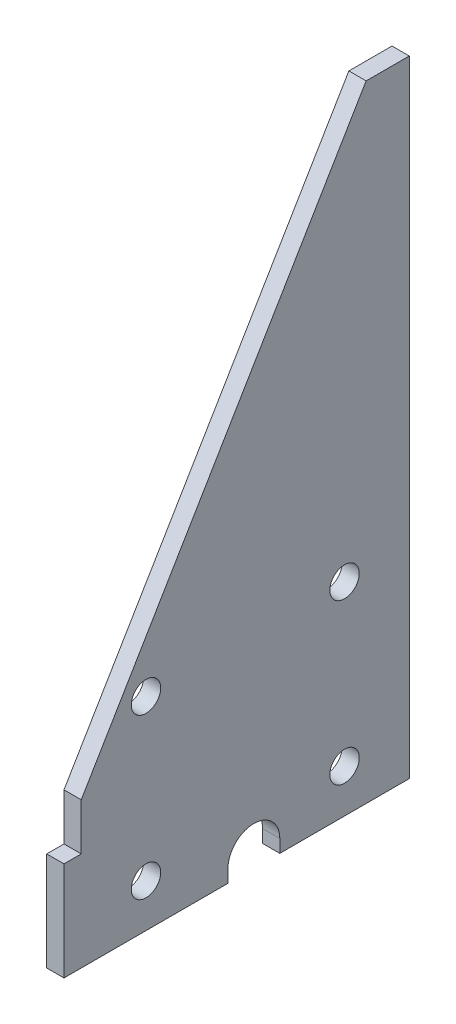
ISO-10303-21;
HEADER;
FILE_DESCRIPTION(('STEP AP214'),'2;1');
FILE_NAME('part.step','',(''),(''),'','','');
FILE_SCHEMA(('AUTOMOTIVE_DESIGN { 1 0 10303 214 1 1 1 1 }'));
ENDSEC;
DATA;
#1=APPLICATION_CONTEXT('core data for automotive mechanical design processes');
#2=APPLICATION_PROTOCOL_DEFINITION('international standard','automotive_design',2000,#1);
#3=PRODUCT_CONTEXT('',#1,'mechanical');
#4=PRODUCT('Part','Part','',(#3));
#5=PRODUCT_RELATED_PRODUCT_CATEGORY('part','',(#4));
#6=PRODUCT_DEFINITION_FORMATION('','',#4);
#7=PRODUCT_DEFINITION_CONTEXT('part definition',#1,'design');
#8=PRODUCT_DEFINITION('design','',#6,#7);
#9=PRODUCT_DEFINITION_SHAPE('','',#8);
#10=(LENGTH_UNIT() NAMED_UNIT(*) SI_UNIT(.MILLI.,.METRE.));
#11=(NAMED_UNIT(*) PLANE_ANGLE_UNIT() SI_UNIT($,.RADIAN.));
#12=(NAMED_UNIT(*) SI_UNIT($,.STERADIAN.) SOLID_ANGLE_UNIT());
#13=UNCERTAINTY_MEASURE_WITH_UNIT(LENGTH_MEASURE(1.E-05),#10,'distance_accuracy_value','');
#14=(GEOMETRIC_REPRESENTATION_CONTEXT(3) GLOBAL_UNCERTAINTY_ASSIGNED_CONTEXT((#13)) GLOBAL_UNIT_ASSIGNED_CONTEXT((#10,
#11,#12)) REPRESENTATION_CONTEXT('',''));
#15=CARTESIAN_POINT('',(0.,0.,0.));
#16=DIRECTION('',(0.,0.,1.));
#17=DIRECTION('',(1.,0.,0.));
#18=AXIS2_PLACEMENT_3D('',#15,#16,#17);
#19=CARTESIAN_POINT('',(4.,-57.5000000000004,37.9999999999989));
#20=DIRECTION('',(0.,1.,0.));
#21=DIRECTION('',(0.,0.,1.));
#22=AXIS2_PLACEMENT_3D('',#19,#20,#21);
#23=PLANE('',#22);
#24=DIRECTION('',(0.,0.,-1.));
#25=VECTOR('',#24,1.);
#26=CARTESIAN_POINT('',(4.,-57.5000000000004,37.9999999999989));
#27=LINE('',#26,#25);
#28=CARTESIAN_POINT('',(4.,-57.5000000000004,-12.0000000000012));
#29=VERTEX_POINT('',#28);
#30=CARTESIAN_POINT('',(4.,-57.5000000000004,-42.0000000000011));
#31=VERTEX_POINT('',#30);
#32=EDGE_CURVE('E205',#29,#31,#27,.T.);
#33=ORIENTED_EDGE('',*,*,#32,.F.);
#34=DIRECTION('',(1.,0.,0.));
#35=VECTOR('',#34,1.);
#36=CARTESIAN_POINT('',(-0.00100000000000013,-57.5000000000004,-12.0000000000012));
#37=LINE('',#36,#35);
#38=CARTESIAN_POINT('',(0.,-57.5000000000004,-12.0000000000012));
#39=VERTEX_POINT('',#38);
#40=EDGE_CURVE('E225',#39,#29,#37,.T.);
#41=ORIENTED_EDGE('',*,*,#40,.F.);
#42=DIRECTION('',(0.,0.,-1.));
#43=VECTOR('',#42,1.);
#44=CARTESIAN_POINT('',(0.,-57.5000000000004,37.9999999999989));
#45=LINE('',#44,#43);
#46=CARTESIAN_POINT('',(0.,-57.5000000000004,-42.0000000000011));
#47=VERTEX_POINT('',#46);
#48=EDGE_CURVE('E165',#39,#47,#45,.T.);
#49=ORIENTED_EDGE('',*,*,#48,.T.);
#50=DIRECTION('',(-1.,0.,0.));
#51=VECTOR('',#50,1.);
#52=CARTESIAN_POINT('',(4.,-57.5000000000004,-42.0000000000011));
#53=LINE('',#52,#51);
#54=EDGE_CURVE('E189',#31,#47,#53,.T.);
#55=ORIENTED_EDGE('',*,*,#54,.F.);
#56=EDGE_LOOP('',(#33,#41,#49,#55));
#57=FACE_BOUND('',#56,.T.);
#58=ADVANCED_FACE('F45',(#57),#23,.F.);
#59=CARTESIAN_POINT('',(4.,87.4999999999995,-32.0000000000012));
#60=DIRECTION('',(0.,1.,0.));
#61=DIRECTION('',(0.,0.,1.));
#62=AXIS2_PLACEMENT_3D('',#59,#60,#61);
#63=PLANE('',#62);
#64=DIRECTION('',(0.,0.,-1.));
#65=VECTOR('',#64,1.);
#66=CARTESIAN_POINT('',(0.,87.4999999999995,-32.0000000000012));
#67=LINE('',#66,#65);
#68=CARTESIAN_POINT('',(0.,87.4999999999995,-32.0000000000012));
#69=VERTEX_POINT('',#68);
#70=CARTESIAN_POINT('',(0.,87.4999999999995,-42.0000000000012));
#71=VERTEX_POINT('',#70);
#72=EDGE_CURVE('E156',#69,#71,#67,.T.);
#73=ORIENTED_EDGE('',*,*,#72,.F.);
#74=DIRECTION('',(-1.,0.,0.));
#75=VECTOR('',#74,1.);
#76=CARTESIAN_POINT('',(4.,87.4999999999995,-32.0000000000012));
#77=LINE('',#76,#75);
#78=CARTESIAN_POINT('',(4.,87.4999999999995,-32.0000000000012));
#79=VERTEX_POINT('',#78);
#80=EDGE_CURVE('E11',#79,#69,#77,.T.);
#81=ORIENTED_EDGE('',*,*,#80,.F.);
#82=DIRECTION('',(0.,0.,-1.));
#83=VECTOR('',#82,1.);
#84=CARTESIAN_POINT('',(4.,87.4999999999995,-32.0000000000012));
#85=LINE('',#84,#83);
#86=CARTESIAN_POINT('',(4.,87.4999999999995,-42.0000000000012));
#87=VERTEX_POINT('',#86);
#88=EDGE_CURVE('E180',#79,#87,#85,.T.);
#89=ORIENTED_EDGE('',*,*,#88,.T.);
#90=DIRECTION('',(-1.,0.,0.));
#91=VECTOR('',#90,1.);
#92=CARTESIAN_POINT('',(4.,87.4999999999995,-42.0000000000012));
#93=LINE('',#92,#91);
#94=EDGE_CURVE('E49',#87,#71,#93,.T.);
#95=ORIENTED_EDGE('',*,*,#94,.T.);
#96=EDGE_LOOP('',(#73,#81,#89,#95));
#97=FACE_BOUND('',#96,.T.);
#98=ADVANCED_FACE('F47',(#97),#63,.T.);
#99=CARTESIAN_POINT('',(4.,87.4999999999995,-32.0000000000012));
#100=DIRECTION('',(0.,-0.510258904912213,-0.860020842746145));
#101=DIRECTION('',(0.,0.860020842746145,-0.510258904912213));
#102=AXIS2_PLACEMENT_3D('',#99,#100,#101);
#103=PLANE('',#102);
#104=DIRECTION('',(0.,-0.860020842746145,0.510258904912213));
#105=VECTOR('',#104,1.);
#106=CARTESIAN_POINT('',(0.,87.4999999999995,-32.0000000000012));
#107=LINE('',#106,#105);
#108=CARTESIAN_POINT('',(0.,-23.7403430392094,33.9999999999989));
#109=VERTEX_POINT('',#108);
#110=EDGE_CURVE('E178',#69,#109,#107,.T.);
#111=ORIENTED_EDGE('',*,*,#110,.T.);
#112=DIRECTION('',(-1.,0.,0.));
#113=VECTOR('',#112,1.);
#114=CARTESIAN_POINT('',(4.,-23.7403430392094,33.9999999999989));
#115=LINE('',#114,#113);
#116=CARTESIAN_POINT('',(4.,-23.7403430392094,33.9999999999989));
#117=VERTEX_POINT('',#116);
#118=EDGE_CURVE('E55',#117,#109,#115,.T.);
#119=ORIENTED_EDGE('',*,*,#118,.F.);
#120=DIRECTION('',(0.,-0.860020842746145,0.510258904912213));
#121=VECTOR('',#120,1.);
#122=CARTESIAN_POINT('',(4.,87.4999999999995,-32.0000000000012));
#123=LINE('',#122,#121);
#124=EDGE_CURVE('E127',#79,#117,#123,.T.);
#125=ORIENTED_EDGE('',*,*,#124,.F.);
#126=ORIENTED_EDGE('',*,*,#80,.T.);
#127=EDGE_LOOP('',(#111,#119,#125,#126));
#128=FACE_BOUND('',#127,.T.);
#129=ADVANCED_FACE('F200',(#128),#103,.F.);
#130=CARTESIAN_POINT('',(4.,-23.7403430392094,33.9999999999989));
#131=DIRECTION('',(0.,0.,-1.));
#132=DIRECTION('',(-1.,0.,0.));
#133=AXIS2_PLACEMENT_3D('',#130,#131,#132);
#134=PLANE('',#133);
#135=DIRECTION('',(0.,-1.,0.));
#136=VECTOR('',#135,1.);
#137=CARTESIAN_POINT('',(0.,-23.7403430392094,33.9999999999989));
#138=LINE('',#137,#136);
#139=CARTESIAN_POINT('',(0.,-34.6028137707301,33.9999999999989));
#140=VERTEX_POINT('',#139);
#141=EDGE_CURVE('E137',#109,#140,#138,.T.);
#142=ORIENTED_EDGE('',*,*,#141,.T.);
#143=DIRECTION('',(-1.,0.,0.));
#144=VECTOR('',#143,1.);
#145=CARTESIAN_POINT('',(4.,-34.6028137707301,33.9999999999989));
#146=LINE('',#145,#144);
#147=CARTESIAN_POINT('',(4.,-34.6028137707301,33.9999999999989));
#148=VERTEX_POINT('',#147);
#149=EDGE_CURVE('E134',#148,#140,#146,.T.);
#150=ORIENTED_EDGE('',*,*,#149,.F.);
#151=DIRECTION('',(0.,-1.,0.));
#152=VECTOR('',#151,1.);
#153=CARTESIAN_POINT('',(4.,-23.7403430392094,33.9999999999989));
#154=LINE('',#153,#152);
#155=EDGE_CURVE('E119',#117,#148,#154,.T.);
#156=ORIENTED_EDGE('',*,*,#155,.F.);
#157=ORIENTED_EDGE('',*,*,#118,.T.);
#158=EDGE_LOOP('',(#142,#150,#156,#157));
#159=FACE_BOUND('',#158,.T.);
#160=ADVANCED_FACE('F135',(#159),#134,.F.);
#161=CARTESIAN_POINT('',(4.,-34.6028137707301,33.9999999999989));
#162=DIRECTION('',(0.,-1.,0.));
#163=DIRECTION('',(0.,0.,-1.));
#164=AXIS2_PLACEMENT_3D('',#161,#162,#163);
#165=PLANE('',#164);
#166=DIRECTION('',(0.,0.,1.));
#167=VECTOR('',#166,1.);
#168=CARTESIAN_POINT('',(0.,-34.6028137707301,33.9999999999989));
#169=LINE('',#168,#167);
#170=CARTESIAN_POINT('',(0.,-34.6028137707301,37.9999999999989));
#171=VERTEX_POINT('',#170);
#172=EDGE_CURVE('E173',#140,#171,#169,.T.);
#173=ORIENTED_EDGE('',*,*,#172,.T.);
#174=DIRECTION('',(-1.,0.,0.));
#175=VECTOR('',#174,1.);
#176=CARTESIAN_POINT('',(4.,-34.6028137707301,37.9999999999989));
#177=LINE('',#176,#175);
#178=CARTESIAN_POINT('',(4.,-34.6028137707301,37.9999999999989));
#179=VERTEX_POINT('',#178);
#180=EDGE_CURVE('E141',#179,#171,#177,.T.);
#181=ORIENTED_EDGE('',*,*,#180,.F.);
#182=DIRECTION('',(0.,0.,1.));
#183=VECTOR('',#182,1.);
#184=CARTESIAN_POINT('',(4.,-34.6028137707301,33.9999999999989));
#185=LINE('',#184,#183);
#186=EDGE_CURVE('E124',#148,#179,#185,.T.);
#187=ORIENTED_EDGE('',*,*,#186,.F.);
#188=ORIENTED_EDGE('',*,*,#149,.T.);
#189=EDGE_LOOP('',(#173,#181,#187,#188));
#190=FACE_BOUND('',#189,.T.);
#191=ADVANCED_FACE('F143',(#190),#165,.F.);
#192=CARTESIAN_POINT('',(4.,-34.6028137707301,37.9999999999989));
#193=DIRECTION('',(0.,0.,-1.));
#194=DIRECTION('',(-1.,0.,0.));
#195=AXIS2_PLACEMENT_3D('',#192,#193,#194);
#196=PLANE('',#195);
#197=DIRECTION('',(0.,-1.,0.));
#198=VECTOR('',#197,1.);
#199=CARTESIAN_POINT('',(0.,-34.6028137707301,37.9999999999989));
#200=LINE('',#199,#198);
#201=CARTESIAN_POINT('',(0.,-57.5000000000004,37.9999999999989));
#202=VERTEX_POINT('',#201);
#203=EDGE_CURVE('E170',#171,#202,#200,.T.);
#204=ORIENTED_EDGE('',*,*,#203,.T.);
#205=DIRECTION('',(-1.,0.,0.));
#206=VECTOR('',#205,1.);
#207=CARTESIAN_POINT('',(4.,-57.5000000000004,37.9999999999989));
#208=LINE('',#207,#206);
#209=CARTESIAN_POINT('',(4.,-57.5000000000004,37.9999999999989));
#210=VERTEX_POINT('',#209);
#211=EDGE_CURVE('E186',#210,#202,#208,.T.);
#212=ORIENTED_EDGE('',*,*,#211,.F.);
#213=DIRECTION('',(0.,-1.,0.));
#214=VECTOR('',#213,1.);
#215=CARTESIAN_POINT('',(4.,-34.6028137707301,37.9999999999989));
#216=LINE('',#215,#214);
#217=EDGE_CURVE('E147',#179,#210,#216,.T.);
#218=ORIENTED_EDGE('',*,*,#217,.F.);
#219=ORIENTED_EDGE('',*,*,#180,.T.);
#220=EDGE_LOOP('',(#204,#212,#218,#219));
#221=FACE_BOUND('',#220,.T.);
#222=ADVANCED_FACE('F309',(#221),#196,.F.);
#223=CARTESIAN_POINT('',(0.,-57.5000000000004,0.));
#224=VERTEX_POINT('',#223);
#225=EDGE_CURVE('E166',#202,#224,#45,.T.);
#226=ORIENTED_EDGE('',*,*,#225,.T.);
#227=DIRECTION('',(1.,0.,0.));
#228=VECTOR('',#227,1.);
#229=CARTESIAN_POINT('',(-0.00100000000000013,-57.5000000000004,-1.13450915328883E-12));
#230=LINE('',#229,#228);
#231=CARTESIAN_POINT('',(4.,-57.5000000000004,-1.13450915328883E-12));
#232=VERTEX_POINT('',#231);
#233=EDGE_CURVE('E63',#224,#232,#230,.T.);
#234=ORIENTED_EDGE('',*,*,#233,.T.);
#235=EDGE_CURVE('E150',#210,#232,#27,.T.);
#236=ORIENTED_EDGE('',*,*,#235,.F.);
#237=ORIENTED_EDGE('',*,*,#211,.T.);
#238=EDGE_LOOP('',(#226,#234,#236,#237));
#239=FACE_BOUND('',#238,.T.);
#240=ADVANCED_FACE('F305',(#239),#23,.F.);
#241=CARTESIAN_POINT('',(4.,87.4999999999995,-42.0000000000012));
#242=DIRECTION('',(0.,0.,-1.));
#243=DIRECTION('',(0.,1.,0.));
#244=AXIS2_PLACEMENT_3D('',#241,#242,#243);
#245=PLANE('',#244);
#246=DIRECTION('',(0.,-1.,0.));
#247=VECTOR('',#246,1.);
#248=CARTESIAN_POINT('',(0.,87.4999999999995,-42.0000000000012));
#249=LINE('',#248,#247);
#250=EDGE_CURVE('E160',#71,#47,#249,.T.);
#251=ORIENTED_EDGE('',*,*,#250,.F.);
#252=ORIENTED_EDGE('',*,*,#94,.F.);
#253=DIRECTION('',(0.,-1.,0.));
#254=VECTOR('',#253,1.);
#255=CARTESIAN_POINT('',(4.,87.4999999999995,-42.0000000000012));
#256=LINE('',#255,#254);
#257=EDGE_CURVE('E201',#87,#31,#256,.T.);
#258=ORIENTED_EDGE('',*,*,#257,.T.);
#259=ORIENTED_EDGE('',*,*,#54,.T.);
#260=EDGE_LOOP('',(#251,#252,#258,#259));
#261=FACE_BOUND('',#260,.T.);
#262=ADVANCED_FACE('F194',(#261),#245,.T.);
#263=CARTESIAN_POINT('',(4.,0.,0.));
#264=DIRECTION('',(-1.,0.,0.));
#265=DIRECTION('',(0.,0.,1.));
#266=AXIS2_PLACEMENT_3D('',#263,#264,#265);
#267=PLANE('',#266);
#268=CARTESIAN_POINT('',(4.,-47.5000000000004,-27.0000000000012));
#269=DIRECTION('',(-1.,0.,0.));
#270=DIRECTION('',(0.,0.,1.));
#271=AXIS2_PLACEMENT_3D('',#268,#269,#270);
#272=CIRCLE('',#271,3.41);
#273=CARTESIAN_POINT('',(4.,-47.5000000000004,-23.5900000000012));
#274=VERTEX_POINT('',#273);
#275=EDGE_CURVE('E240',#274,#274,#272,.F.);
#276=ORIENTED_EDGE('',*,*,#275,.F.);
#277=EDGE_LOOP('',(#276));
#278=FACE_BOUND('',#277,.T.);
#279=CARTESIAN_POINT('',(4.,-47.5000000000004,18.9999999999989));
#280=DIRECTION('',(-1.,0.,0.));
#281=DIRECTION('',(0.,0.,1.));
#282=AXIS2_PLACEMENT_3D('',#279,#280,#281);
#283=CIRCLE('',#282,3.41);
#284=CARTESIAN_POINT('',(4.,-47.5000000000004,22.4099999999989));
#285=VERTEX_POINT('',#284);
#286=EDGE_CURVE('E247',#285,#285,#283,.F.);
#287=ORIENTED_EDGE('',*,*,#286,.F.);
#288=EDGE_LOOP('',(#287));
#289=FACE_BOUND('',#288,.T.);
#290=CARTESIAN_POINT('',(4.,-10.5000000000004,-27.0000000000011));
#291=DIRECTION('',(-1.,0.,0.));
#292=DIRECTION('',(0.,0.,1.));
#293=AXIS2_PLACEMENT_3D('',#290,#291,#292);
#294=CIRCLE('',#293,3.41);
#295=CARTESIAN_POINT('',(4.,-10.5000000000004,-23.5900000000011));
#296=VERTEX_POINT('',#295);
#297=EDGE_CURVE('E161',#296,#296,#294,.F.);
#298=ORIENTED_EDGE('',*,*,#297,.F.);
#299=EDGE_LOOP('',(#298));
#300=FACE_BOUND('',#299,.T.);
#301=CARTESIAN_POINT('',(4.,-10.5000000000004,18.9999999999989));
#302=DIRECTION('',(-1.,0.,0.));
#303=DIRECTION('',(0.,0.,1.));
#304=AXIS2_PLACEMENT_3D('',#301,#302,#303);
#305=CIRCLE('',#304,3.41);
#306=CARTESIAN_POINT('',(4.,-10.5000000000004,22.4099999999989));
#307=VERTEX_POINT('',#306);
#308=EDGE_CURVE('E208',#307,#307,#305,.F.);
#309=ORIENTED_EDGE('',*,*,#308,.F.);
#310=EDGE_LOOP('',(#309));
#311=FACE_BOUND('',#310,.T.);
#312=CARTESIAN_POINT('',(4.,-54.5000000000004,-6.00000000000113));
#313=DIRECTION('',(1.,0.,0.));
#314=DIRECTION('',(0.,0.,-1.));
#315=AXIS2_PLACEMENT_3D('',#312,#313,#314);
#316=CIRCLE('',#315,6.00000000000001);
#317=CARTESIAN_POINT('',(4.,-54.5000000000004,-12.0000000000012));
#318=VERTEX_POINT('',#317);
#319=CARTESIAN_POINT('',(4.,-54.5000000000004,-1.13450915328883E-12));
#320=VERTEX_POINT('',#319);
#321=EDGE_CURVE('E275',#318,#320,#316,.T.);
#322=ORIENTED_EDGE('',*,*,#321,.F.);
#323=DIRECTION('',(0.,1.,0.));
#324=VECTOR('',#323,1.);
#325=CARTESIAN_POINT('',(4.,-57.5000000000004,-12.0000000000012));
#326=LINE('',#325,#324);
#327=EDGE_CURVE('E220',#29,#318,#326,.T.);
#328=ORIENTED_EDGE('',*,*,#327,.F.);
#329=ORIENTED_EDGE('',*,*,#32,.T.);
#330=ORIENTED_EDGE('',*,*,#257,.F.);
#331=ORIENTED_EDGE('',*,*,#88,.F.);
#332=ORIENTED_EDGE('',*,*,#124,.T.);
#333=ORIENTED_EDGE('',*,*,#155,.T.);
#334=ORIENTED_EDGE('',*,*,#186,.T.);
#335=ORIENTED_EDGE('',*,*,#217,.T.);
#336=ORIENTED_EDGE('',*,*,#235,.T.);
#337=DIRECTION('',(0.,-1.,0.));
#338=VECTOR('',#337,1.);
#339=CARTESIAN_POINT('',(4.,-54.5000000000004,-1.13450915328883E-12));
#340=LINE('',#339,#338);
#341=EDGE_CURVE('E272',#320,#232,#340,.T.);
#342=ORIENTED_EDGE('',*,*,#341,.F.);
#343=EDGE_LOOP('',(#322,#328,#329,#330,#331,#332,#333,#334,#335,#336,#342));
#344=FACE_BOUND('',#343,.T.);
#345=ADVANCED_FACE('F122',(#278,#289,#300,#311,#344),#267,.F.);
#346=CARTESIAN_POINT('',(0.,0.,0.));
#347=DIRECTION('',(-1.,0.,0.));
#348=DIRECTION('',(0.,0.,1.));
#349=AXIS2_PLACEMENT_3D('',#346,#347,#348);
#350=PLANE('',#349);
#351=DIRECTION('',(0.,1.,0.));
#352=VECTOR('',#351,1.);
#353=CARTESIAN_POINT('',(0.,-57.5000000000004,-12.0000000000012));
#354=LINE('',#353,#352);
#355=CARTESIAN_POINT('',(0.,-54.5000000000004,-12.0000000000011));
#356=VERTEX_POINT('',#355);
#357=EDGE_CURVE('E279',#39,#356,#354,.T.);
#358=ORIENTED_EDGE('',*,*,#357,.T.);
#359=CARTESIAN_POINT('',(0.,-54.5000000000004,-6.00000000000113));
#360=DIRECTION('',(-1.,0.,0.));
#361=DIRECTION('',(0.,0.,1.));
#362=AXIS2_PLACEMENT_3D('',#359,#360,#361);
#363=CIRCLE('',#362,6.00000000000001);
#364=CARTESIAN_POINT('',(0.,-54.5000000000004,-1.13450915328883E-12));
#365=VERTEX_POINT('',#364);
#366=EDGE_CURVE('E282',#356,#365,#363,.F.);
#367=ORIENTED_EDGE('',*,*,#366,.T.);
#368=DIRECTION('',(0.,-1.,0.));
#369=VECTOR('',#368,1.);
#370=CARTESIAN_POINT('',(0.,-54.5000000000004,-1.13450915328883E-12));
#371=LINE('',#370,#369);
#372=EDGE_CURVE('E255',#365,#224,#371,.T.);
#373=ORIENTED_EDGE('',*,*,#372,.T.);
#374=ORIENTED_EDGE('',*,*,#225,.F.);
#375=ORIENTED_EDGE('',*,*,#203,.F.);
#376=ORIENTED_EDGE('',*,*,#172,.F.);
#377=ORIENTED_EDGE('',*,*,#141,.F.);
#378=ORIENTED_EDGE('',*,*,#110,.F.);
#379=ORIENTED_EDGE('',*,*,#72,.T.);
#380=ORIENTED_EDGE('',*,*,#250,.T.);
#381=ORIENTED_EDGE('',*,*,#48,.F.);
#382=EDGE_LOOP('',(#358,#367,#373,#374,#375,#376,#377,#378,#379,#380,#381));
#383=FACE_BOUND('',#382,.T.);
#384=CARTESIAN_POINT('',(0.,-47.5000000000004,-27.0000000000012));
#385=DIRECTION('',(-1.,0.,0.));
#386=DIRECTION('',(0.,0.,1.));
#387=AXIS2_PLACEMENT_3D('',#384,#385,#386);
#388=CIRCLE('',#387,3.41);
#389=CARTESIAN_POINT('',(0.,-47.5000000000004,-23.5900000000012));
#390=VERTEX_POINT('',#389);
#391=EDGE_CURVE('E243',#390,#390,#388,.T.);
#392=ORIENTED_EDGE('',*,*,#391,.F.);
#393=EDGE_LOOP('',(#392));
#394=FACE_BOUND('',#393,.T.);
#395=CARTESIAN_POINT('',(0.,-47.5000000000004,18.9999999999989));
#396=DIRECTION('',(-1.,0.,0.));
#397=DIRECTION('',(0.,0.,1.));
#398=AXIS2_PLACEMENT_3D('',#395,#396,#397);
#399=CIRCLE('',#398,3.41);
#400=CARTESIAN_POINT('',(0.,-47.5000000000004,22.4099999999989));
#401=VERTEX_POINT('',#400);
#402=EDGE_CURVE('E251',#401,#401,#399,.T.);
#403=ORIENTED_EDGE('',*,*,#402,.F.);
#404=EDGE_LOOP('',(#403));
#405=FACE_BOUND('',#404,.T.);
#406=CARTESIAN_POINT('',(0.,-10.5000000000004,-27.0000000000011));
#407=DIRECTION('',(-1.,0.,0.));
#408=DIRECTION('',(0.,0.,1.));
#409=AXIS2_PLACEMENT_3D('',#406,#407,#408);
#410=CIRCLE('',#409,3.41);
#411=CARTESIAN_POINT('',(0.,-10.5000000000004,-23.5900000000011));
#412=VERTEX_POINT('',#411);
#413=EDGE_CURVE('E230',#412,#412,#410,.T.);
#414=ORIENTED_EDGE('',*,*,#413,.F.);
#415=EDGE_LOOP('',(#414));
#416=FACE_BOUND('',#415,.T.);
#417=CARTESIAN_POINT('',(0.,-10.5000000000004,18.9999999999989));
#418=DIRECTION('',(-1.,0.,0.));
#419=DIRECTION('',(0.,0.,1.));
#420=AXIS2_PLACEMENT_3D('',#417,#418,#419);
#421=CIRCLE('',#420,3.41);
#422=CARTESIAN_POINT('',(0.,-10.5000000000004,22.4099999999989));
#423=VERTEX_POINT('',#422);
#424=EDGE_CURVE('E237',#423,#423,#421,.T.);
#425=ORIENTED_EDGE('',*,*,#424,.F.);
#426=EDGE_LOOP('',(#425));
#427=FACE_BOUND('',#426,.T.);
#428=ADVANCED_FACE('F198',(#383,#394,#405,#416,#427),#350,.T.);
#429=CARTESIAN_POINT('',(4.001,-10.5000000000004,18.9999999999989));
#430=DIRECTION('',(-1.,0.,0.));
#431=DIRECTION('',(0.,0.,1.));
#432=AXIS2_PLACEMENT_3D('',#429,#430,#431);
#433=CYLINDRICAL_SURFACE('',#432,3.41);
#434=ORIENTED_EDGE('',*,*,#424,.T.);
#435=EDGE_LOOP('',(#434));
#436=FACE_BOUND('',#435,.T.);
#437=ORIENTED_EDGE('',*,*,#308,.T.);
#438=EDGE_LOOP('',(#437));
#439=FACE_BOUND('',#438,.T.);
#440=ADVANCED_FACE('F333',(#436,#439),#433,.F.);
#441=CARTESIAN_POINT('',(4.001,-10.5000000000004,-27.0000000000011));
#442=DIRECTION('',(-1.,0.,0.));
#443=DIRECTION('',(0.,0.,1.));
#444=AXIS2_PLACEMENT_3D('',#441,#442,#443);
#445=CYLINDRICAL_SURFACE('',#444,3.41);
#446=ORIENTED_EDGE('',*,*,#413,.T.);
#447=EDGE_LOOP('',(#446));
#448=FACE_BOUND('',#447,.T.);
#449=ORIENTED_EDGE('',*,*,#297,.T.);
#450=EDGE_LOOP('',(#449));
#451=FACE_BOUND('',#450,.T.);
#452=ADVANCED_FACE('F386',(#448,#451),#445,.F.);
#453=CARTESIAN_POINT('',(4.001,-47.5000000000004,18.9999999999989));
#454=DIRECTION('',(-1.,0.,0.));
#455=DIRECTION('',(0.,0.,1.));
#456=AXIS2_PLACEMENT_3D('',#453,#454,#455);
#457=CYLINDRICAL_SURFACE('',#456,3.41);
#458=ORIENTED_EDGE('',*,*,#402,.T.);
#459=EDGE_LOOP('',(#458));
#460=FACE_BOUND('',#459,.T.);
#461=ORIENTED_EDGE('',*,*,#286,.T.);
#462=EDGE_LOOP('',(#461));
#463=FACE_BOUND('',#462,.T.);
#464=ADVANCED_FACE('F395',(#460,#463),#457,.F.);
#465=CARTESIAN_POINT('',(4.001,-47.5000000000004,-27.0000000000012));
#466=DIRECTION('',(-1.,0.,0.));
#467=DIRECTION('',(0.,0.,1.));
#468=AXIS2_PLACEMENT_3D('',#465,#466,#467);
#469=CYLINDRICAL_SURFACE('',#468,3.41);
#470=ORIENTED_EDGE('',*,*,#391,.T.);
#471=EDGE_LOOP('',(#470));
#472=FACE_BOUND('',#471,.T.);
#473=ORIENTED_EDGE('',*,*,#275,.T.);
#474=EDGE_LOOP('',(#473));
#475=FACE_BOUND('',#474,.T.);
#476=ADVANCED_FACE('F404',(#472,#475),#469,.F.);
#477=CARTESIAN_POINT('',(-0.00100000000000013,-54.5000000000004,-6.00000000000113));
#478=DIRECTION('',(1.,0.,0.));
#479=DIRECTION('',(0.,0.,-1.));
#480=AXIS2_PLACEMENT_3D('',#477,#478,#479);
#481=CYLINDRICAL_SURFACE('',#480,6.00000000000001);
#482=DIRECTION('',(1.,0.,0.));
#483=VECTOR('',#482,1.);
#484=CARTESIAN_POINT('',(-0.00100000000000013,-54.5000000000004,-12.0000000000012));
#485=LINE('',#484,#483);
#486=EDGE_CURVE('E258',#356,#318,#485,.T.);
#487=ORIENTED_EDGE('',*,*,#486,.T.);
#488=ORIENTED_EDGE('',*,*,#321,.T.);
#489=DIRECTION('',(1.,0.,0.));
#490=VECTOR('',#489,1.);
#491=CARTESIAN_POINT('',(-0.00100000000000013,-54.5000000000004,-1.13450915328883E-12));
#492=LINE('',#491,#490);
#493=EDGE_CURVE('E266',#365,#320,#492,.T.);
#494=ORIENTED_EDGE('',*,*,#493,.F.);
#495=ORIENTED_EDGE('',*,*,#366,.F.);
#496=EDGE_LOOP('',(#487,#488,#494,#495));
#497=FACE_BOUND('',#496,.T.);
#498=ADVANCED_FACE('F295',(#497),#481,.F.);
#499=CARTESIAN_POINT('',(-0.00100000000000013,-57.5000000000004,-12.0000000000012));
#500=DIRECTION('',(0.,0.,-1.));
#501=DIRECTION('',(-1.,0.,0.));
#502=AXIS2_PLACEMENT_3D('',#499,#500,#501);
#503=PLANE('',#502);
#504=ORIENTED_EDGE('',*,*,#40,.T.);
#505=ORIENTED_EDGE('',*,*,#327,.T.);
#506=ORIENTED_EDGE('',*,*,#486,.F.);
#507=ORIENTED_EDGE('',*,*,#357,.F.);
#508=EDGE_LOOP('',(#504,#505,#506,#507));
#509=FACE_BOUND('',#508,.T.);
#510=ADVANCED_FACE('F299',(#509),#503,.F.);
#511=CARTESIAN_POINT('',(-0.00100000000000013,-54.5000000000004,-1.13450915328883E-12));
#512=DIRECTION('',(0.,0.,1.));
#513=DIRECTION('',(1.,0.,0.));
#514=AXIS2_PLACEMENT_3D('',#511,#512,#513);
#515=PLANE('',#514);
#516=ORIENTED_EDGE('',*,*,#493,.T.);
#517=ORIENTED_EDGE('',*,*,#341,.T.);
#518=ORIENTED_EDGE('',*,*,#233,.F.);
#519=ORIENTED_EDGE('',*,*,#372,.F.);
#520=EDGE_LOOP('',(#516,#517,#518,#519));
#521=FACE_BOUND('',#520,.T.);
#522=ADVANCED_FACE('F303',(#521),#515,.F.);
#523=CLOSED_SHELL('',(#58,#98,#129,#160,#191,#222,#240,#262,#345,#428,#440,#452,#464,#476,#498,
#510,#522));
#524=MANIFOLD_SOLID_BREP('B2',#523);
#525=ADVANCED_BREP_SHAPE_REPRESENTATION('',(#18,#524),#14);
#526=SHAPE_DEFINITION_REPRESENTATION(#9,#525);
ENDSEC;
END-ISO-10303-21;
